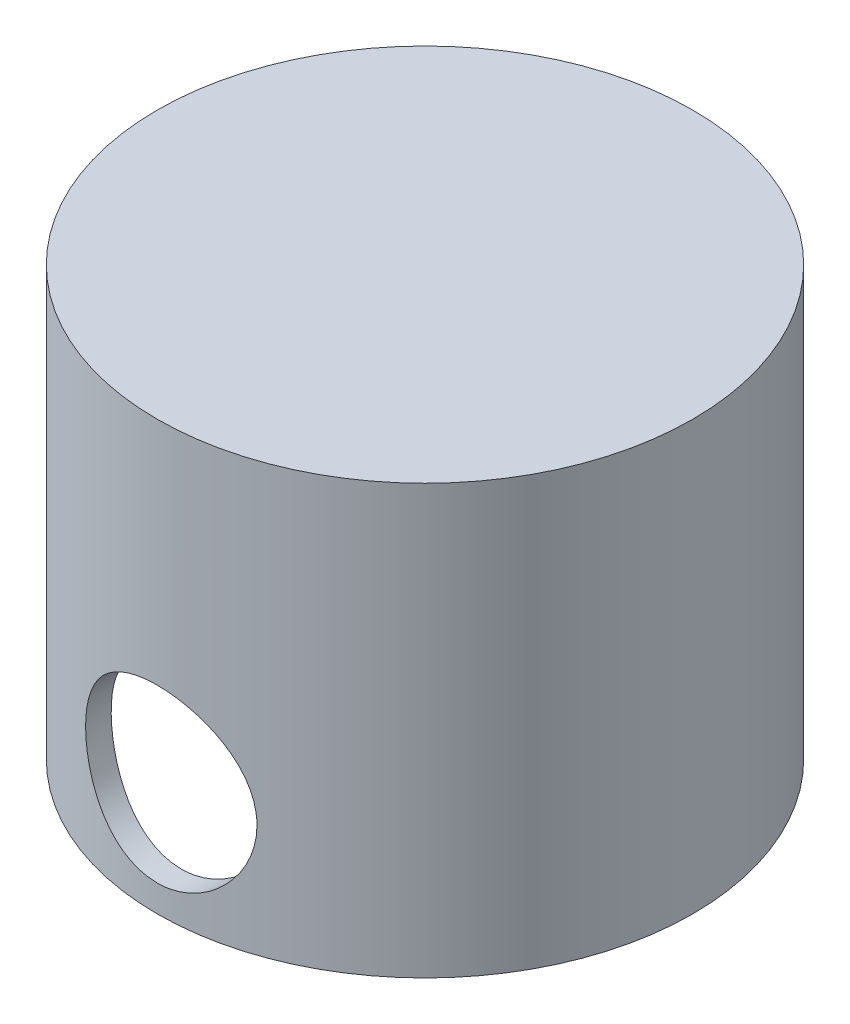
ISO-10303-21;
HEADER;
FILE_DESCRIPTION(('STEP AP214'),'2;1');
FILE_NAME('part.step','',(''),(''),'','','');
FILE_SCHEMA(('AUTOMOTIVE_DESIGN { 1 0 10303 214 1 1 1 1 }'));
ENDSEC;
DATA;
#1=APPLICATION_CONTEXT('core data for automotive mechanical design processes');
#2=APPLICATION_PROTOCOL_DEFINITION('international standard','automotive_design',2000,#1);
#3=PRODUCT_CONTEXT('',#1,'mechanical');
#4=PRODUCT('Part','Part','',(#3));
#5=PRODUCT_RELATED_PRODUCT_CATEGORY('part','',(#4));
#6=PRODUCT_DEFINITION_FORMATION('','',#4);
#7=PRODUCT_DEFINITION_CONTEXT('part definition',#1,'design');
#8=PRODUCT_DEFINITION('design','',#6,#7);
#9=PRODUCT_DEFINITION_SHAPE('','',#8);
#10=(LENGTH_UNIT() NAMED_UNIT(*) SI_UNIT(.MILLI.,.METRE.));
#11=(NAMED_UNIT(*) PLANE_ANGLE_UNIT() SI_UNIT($,.RADIAN.));
#12=(NAMED_UNIT(*) SI_UNIT($,.STERADIAN.) SOLID_ANGLE_UNIT());
#13=UNCERTAINTY_MEASURE_WITH_UNIT(LENGTH_MEASURE(1.E-05),#10,'distance_accuracy_value','');
#14=(GEOMETRIC_REPRESENTATION_CONTEXT(3) GLOBAL_UNCERTAINTY_ASSIGNED_CONTEXT((#13)) GLOBAL_UNIT_ASSIGNED_CONTEXT((#10,
#11,#12)) REPRESENTATION_CONTEXT('',''));
#15=CARTESIAN_POINT('',(0.,0.,0.));
#16=DIRECTION('',(0.,0.,1.));
#17=DIRECTION('',(1.,0.,0.));
#18=AXIS2_PLACEMENT_3D('',#15,#16,#17);
#19=CARTESIAN_POINT('',(0.,8.,0.));
#20=DIRECTION('',(0.,-1.,0.));
#21=DIRECTION('',(0.,0.,-1.));
#22=AXIS2_PLACEMENT_3D('',#19,#20,#21);
#23=CYLINDRICAL_SURFACE('',#22,5.);
#24=CARTESIAN_POINT('',(0.,3.7,-5.));
#25=CARTESIAN_POINT('',(-0.0874958063159798,3.69999975634942,-4.99999978543627));
#26=CARTESIAN_POINT('',(-0.174994637059061,3.69279940472074,-4.99768184156355));
#27=CARTESIAN_POINT('',(-0.347426901237483,3.66426818047074,-4.98866262172227));
#28=CARTESIAN_POINT('',(-0.432359863373708,3.64293472818209,-4.98196054553558));
#29=CARTESIAN_POINT('',(-0.597149225791565,3.58693507878823,-4.9649038363541));
#30=CARTESIAN_POINT('',(-0.677013473384596,3.55229010762939,-4.95455502045191));
#31=CARTESIAN_POINT('',(-0.829798762851158,3.47074316991274,-4.93126901642872));
#32=CARTESIAN_POINT('',(-0.902718607024946,3.42383909423439,-4.91833138300386));
#33=CARTESIAN_POINT('',(-1.04189475779498,3.31751588649597,-4.89077067933825));
#34=CARTESIAN_POINT('',(-1.1078960922464,3.25777290104658,-4.87610957732918));
#35=CARTESIAN_POINT('',(-1.22913423693228,3.12815693345259,-4.8469706570307));
#36=CARTESIAN_POINT('',(-1.28436891793797,3.05828195234513,-4.83249287552328));
#37=CARTESIAN_POINT('',(-1.38391395073831,2.90814714548961,-4.80494810799029));
#38=CARTESIAN_POINT('',(-1.42790123109944,2.82766371872945,-4.79192785635417));
#39=CARTESIAN_POINT('',(-1.5016091713459,2.65995765622989,-4.76934657798646));
#40=CARTESIAN_POINT('',(-1.53133379773326,2.57273690201169,-4.75978458968016));
#41=CARTESIAN_POINT('',(-1.57473134311321,2.39691739272712,-4.74560122760597));
#42=CARTESIAN_POINT('',(-1.58887896846385,2.30844789824797,-4.74083414932744));
#43=CARTESIAN_POINT('',(-1.60220433058851,2.13027240081554,-4.73634831045));
#44=CARTESIAN_POINT('',(-1.6013862709372,2.04056675214802,-4.73662813227306));
#45=CARTESIAN_POINT('',(-1.58517380736381,1.86643441511176,-4.74207619100075));
#46=CARTESIAN_POINT('',(-1.57038842132725,1.7819435465553,-4.7470401743042));
#47=CARTESIAN_POINT('',(-1.52765058974139,1.61671115557794,-4.76096457446162));
#48=CARTESIAN_POINT('',(-1.49969668269327,1.5359700504148,-4.76992543490025));
#49=CARTESIAN_POINT('',(-1.43099645158812,1.37910214117426,-4.7909865416364));
#50=CARTESIAN_POINT('',(-1.39006273103722,1.30306378004852,-4.80313229469362));
#51=CARTESIAN_POINT('',(-1.29669494334068,1.15873795697323,-4.82917444861168));
#52=CARTESIAN_POINT('',(-1.24425776827155,1.09045259725646,-4.8430713221454));
#53=CARTESIAN_POINT('',(-1.12640551540387,0.960135327133716,-4.87186372141871));
#54=CARTESIAN_POINT('',(-1.06048936249402,0.898559223061187,-4.8867752080818));
#55=CARTESIAN_POINT('',(-0.919081432217149,0.787221321766352,-4.91533168114877));
#56=CARTESIAN_POINT('',(-0.843588875652695,0.737460486857106,-4.92897656433707));
#57=CARTESIAN_POINT('',(-0.684261580712375,0.650836556719775,-4.95361789744584));
#58=CARTESIAN_POINT('',(-0.600361279440636,0.614086899163568,-4.96459080547942));
#59=CARTESIAN_POINT('',(-0.427135850361131,0.555360403337291,-4.98248161100196));
#60=CARTESIAN_POINT('',(-0.337812463131548,0.533378852183283,-4.98940080204637));
#61=CARTESIAN_POINT('',(-0.160141789589318,0.505599933334783,-4.99819424239135));
#62=CARTESIAN_POINT('',(-0.0719002860170735,0.499185926388898,-5.00026060178154));
#63=CARTESIAN_POINT('',(0.104410269588106,0.500979218221303,-4.99968655318444));
#64=CARTESIAN_POINT('',(0.19247934608744,0.50918426530988,-4.99704687004206));
#65=CARTESIAN_POINT('',(0.363535018203812,0.539490113081165,-4.98748380317497));
#66=CARTESIAN_POINT('',(0.446594362478023,0.561219910085902,-4.98067486649266));
#67=CARTESIAN_POINT('',(0.607861654600583,0.617501799396251,-4.96357585995349));
#68=CARTESIAN_POINT('',(0.686068993794125,0.652055496602176,-4.95328535439547));
#69=CARTESIAN_POINT('',(0.837596923870445,0.733971017178152,-4.92995531019905));
#70=CARTESIAN_POINT('',(0.910745620500967,0.781632511942304,-4.9168532627009));
#71=CARTESIAN_POINT('',(1.04821150300662,0.888053872985635,-4.8893940824048));
#72=CARTESIAN_POINT('',(1.11252617555398,0.946816886458304,-4.87503659432078));
#73=CARTESIAN_POINT('',(1.23328321488635,1.07667415961096,-4.84592967283237));
#74=CARTESIAN_POINT('',(1.2892857947562,1.14818026768848,-4.83118884166735));
#75=CARTESIAN_POINT('',(1.38854141992569,1.29989467445821,-4.80360443110145));
#76=CARTESIAN_POINT('',(1.43179457025642,1.38010290145405,-4.79076083607138));
#77=CARTESIAN_POINT('',(1.50407580301231,1.54684357865608,-4.76856262886575));
#78=CARTESIAN_POINT('',(1.53315066307446,1.63335413498969,-4.75919656820051));
#79=CARTESIAN_POINT('',(1.57620668246201,1.81040720981032,-4.74511281699328));
#80=CARTESIAN_POINT('',(1.59019395006567,1.90094808113598,-4.74039324536734));
#81=CARTESIAN_POINT('',(1.60222535311566,2.07887596916399,-4.73633927898768));
#82=CARTESIAN_POINT('',(1.60099388446006,2.16620901132899,-4.73676019091382));
#83=CARTESIAN_POINT('',(1.5843835514937,2.3393570054347,-4.74234159093745));
#84=CARTESIAN_POINT('',(1.56900540861121,2.42517203456103,-4.74750183734632));
#85=CARTESIAN_POINT('',(1.52503332416461,2.59148342537688,-4.76180543144416));
#86=CARTESIAN_POINT('',(1.49665627942706,2.67204319889287,-4.77088327236763));
#87=CARTESIAN_POINT('',(1.42766427484382,2.82732176040081,-4.79197975594362));
#88=CARTESIAN_POINT('',(1.38704674114626,2.9020393157627,-4.8039990169992));
#89=CARTESIAN_POINT('',(1.29279266707432,3.04680962981441,-4.83023494368376));
#90=CARTESIAN_POINT('',(1.23869308431579,3.11654826273404,-4.8445211905268));
#91=CARTESIAN_POINT('',(1.11981399792885,3.24619174582096,-4.87337180847353));
#92=CARTESIAN_POINT('',(1.05503158166823,3.30609390519864,-4.88793625446696));
#93=CARTESIAN_POINT('',(0.913912210298352,3.41645828592383,-4.91631108200117));
#94=CARTESIAN_POINT('',(0.83725135176078,3.4665189518843,-4.93007751880386));
#95=CARTESIAN_POINT('',(0.676163529926937,3.55298018809723,-4.9547378769786));
#96=CARTESIAN_POINT('',(0.591739263208157,3.58938547932079,-4.96563279071293));
#97=CARTESIAN_POINT('',(0.423663431644845,3.64524777983044,-4.98268341064065));
#98=CARTESIAN_POINT('',(0.34037676648733,3.66571845058311,-4.98911901301451));
#99=CARTESIAN_POINT('',(0.171394001076119,3.69309314290401,-4.99777693541394));
#100=CARTESIAN_POINT('',(0.0856984512613947,3.70000023864547,-5.00000021015613));
#101=CARTESIAN_POINT('',(0.,3.7,-5.));
#102=B_SPLINE_CURVE_WITH_KNOTS('',3,(#24,#25,#26,#27,#28,#29,#30,#31,#32,#33,#34,#35,#36,#37,
#38,#39,#40,#41,#42,#43,#44,#45,#46,#47,#48,#49,#50,#51,#52,#53,#54,#55,#56,#57,#58,#59,#60,#61,
#62,#63,#64,#65,#66,#67,#68,#69,#70,#71,#72,#73,#74,#75,#76,#77,#78,#79,#80,#81,#82,#83,#84,#85,
#86,#87,#88,#89,#90,#91,#92,#93,#94,#95,#96,#97,#98,#99,#100,#101),.UNSPECIFIED.,.T.,.F.,(4,2,2,
2,2,2,2,2,2,2,2,2,2,2,2,2,2,2,2,2,2,2,2,2,2,2,2,2,2,2,2,2,2,2,2,2,2,2,4),(0.,0.262172289866487,
0.524392446348364,0.786196202111712,1.04804502964703,1.31749718151567,1.58700256668426,
1.86354828826627,2.14001705671955,2.40780489999507,2.67551752794223,2.93207089351445,
3.18865273918778,3.44912195934763,3.70966163813009,3.98267284808623,4.25570628624555,
4.53106471334194,4.80633522466348,5.07051010591344,5.33464430132699,5.59183416387789,
5.84905622438333,6.11273355055081,6.37648573964818,6.6512299305306,6.92597185797942,
7.19980110675104,7.47351945288796,7.73426134972847,7.99498995042988,8.25151822881316,
8.50810048600705,8.77513756675922,9.04224757485583,9.3186628553126,9.5949824844973,
9.85182740305348,10.1086141011961),.UNSPECIFIED.);
#103=CARTESIAN_POINT('',(0.,3.7,-5.));
#104=VERTEX_POINT('',#103);
#105=EDGE_CURVE('E93',#104,#104,#102,.T.);
#106=ORIENTED_EDGE('',*,*,#105,.T.);
#107=EDGE_LOOP('',(#106));
#108=FACE_BOUND('',#107,.T.);
#109=CARTESIAN_POINT('',(1.6,2.1,4.7370877129308));
#110=CARTESIAN_POINT('',(1.59999974373874,2.01263376201709,4.73708798780949));
#111=CARTESIAN_POINT('',(1.59281993166463,1.9252644962471,4.73953109593308));
#112=CARTESIAN_POINT('',(1.56437769172507,1.75310041237817,4.7489937190314));
#113=CARTESIAN_POINT('',(1.54311199666736,1.66830619633013,4.75601429573487));
#114=CARTESIAN_POINT('',(1.48731021882536,1.50381189835967,4.77375701461625));
#115=CARTESIAN_POINT('',(1.45279850166911,1.42410277469806,4.78447235673699));
#116=CARTESIAN_POINT('',(1.37156634454408,1.27158235897785,4.80838765550231));
#117=CARTESIAN_POINT('',(1.32484355228541,1.19877239963129,4.82158809072754));
#118=CARTESIAN_POINT('',(1.21871241953147,1.0594936048683,4.84951968764674));
#119=CARTESIAN_POINT('',(1.15893934729319,0.993309834525259,4.86428678030524));
#120=CARTESIAN_POINT('',(1.02918412233017,0.871713574136107,4.89338280213669));
#121=CARTESIAN_POINT('',(0.959200473487308,0.81630266537781,4.90771166672489));
#122=CARTESIAN_POINT('',(0.808949422462771,0.716554614700008,4.93472953085556));
#123=CARTESIAN_POINT('',(0.728476687860992,0.672512850690743,4.94737131144711));
#124=CARTESIAN_POINT('',(0.560792193508548,0.598701436034369,4.96916970645467));
#125=CARTESIAN_POINT('',(0.473582105406685,0.56892825823732,4.97832718206453));
#126=CARTESIAN_POINT('',(0.297884710119076,0.525456220771644,4.99187078015161));
#127=CARTESIAN_POINT('',(0.209529388874192,0.511269742338392,4.99640130994181));
#128=CARTESIAN_POINT('',(0.0315841299204926,0.497826894498892,5.00069148119392));
#129=CARTESIAN_POINT('',(-0.0580055088308472,0.498566971198204,5.00045225829628));
#130=CARTESIAN_POINT('',(-0.232437491666958,0.514639501972373,4.9953294799159));
#131=CARTESIAN_POINT('',(-0.317334316303528,0.529442997840621,4.99061428137964));
#132=CARTESIAN_POINT('',(-0.48336829364963,0.572351823241146,4.97727793973528));
#133=CARTESIAN_POINT('',(-0.564505196993056,0.60045803365593,4.96865653796686));
#134=CARTESIAN_POINT('',(-0.721913949614886,0.66950323251782,4.94825462002066));
#135=CARTESIAN_POINT('',(-0.798111771873498,0.710599181593562,4.93643573330445));
#136=CARTESIAN_POINT('',(-0.942691437411139,0.804330206898552,4.9108788342044));
#137=CARTESIAN_POINT('',(-1.01107122500451,0.856968307470621,4.89714031917112));
#138=CARTESIAN_POINT('',(-1.14122552524351,0.974987641733184,4.86849469180912));
#139=CARTESIAN_POINT('',(-1.2025821378014,1.04082436305752,4.85356274482591));
#140=CARTESIAN_POINT('',(-1.31351207358059,1.1819882609796,4.8247258395209));
#141=CARTESIAN_POINT('',(-1.36308386476992,1.25731666955544,4.81082101488724));
#142=CARTESIAN_POINT('',(-1.44955524382539,1.41655674029327,4.78548357380621));
#143=CARTESIAN_POINT('',(-1.48629250439436,1.50056207537524,4.77408325840667));
#144=CARTESIAN_POINT('',(-1.54496461752815,1.67402080639224,4.75542251488665));
#145=CARTESIAN_POINT('',(-1.56690509705448,1.76347211719119,4.74816051319963));
#146=CARTESIAN_POINT('',(-1.59453893191269,1.94126391009052,4.73895031775712));
#147=CARTESIAN_POINT('',(-1.60087507754216,2.02949364832457,4.73679204354283));
#148=CARTESIAN_POINT('',(-1.59893067907134,2.20576427053874,4.73744898777772));
#149=CARTESIAN_POINT('',(-1.5906525297045,2.2938051830935,4.74026339139206));
#150=CARTESIAN_POINT('',(-1.56029013344713,2.46437702734367,4.7503404414304));
#151=CARTESIAN_POINT('',(-1.53863886571376,2.54699414669862,4.75746344492905));
#152=CARTESIAN_POINT('',(-1.48265712290061,2.70741115974012,4.77520515081817));
#153=CARTESIAN_POINT('',(-1.44832451458384,2.78521024037054,4.78582444131636));
#154=CARTESIAN_POINT('',(-1.3667895840503,2.93634784716175,4.80975442366493));
#155=CARTESIAN_POINT('',(-1.31923446955668,3.0094845588093,4.8231358439457));
#156=CARTESIAN_POINT('',(-1.2130119976528,3.1469734221838,4.85093919332853));
#157=CARTESIAN_POINT('',(-1.15434161483455,3.21132317400831,4.86536140505509));
#158=CARTESIAN_POINT('',(-1.02450097804918,3.3323191106342,4.89438512522789));
#159=CARTESIAN_POINT('',(-0.952895991490041,3.38850480158372,4.90896684906861));
#160=CARTESIAN_POINT('',(-0.800918884886269,3.48808507727672,4.93603865529218));
#161=CARTESIAN_POINT('',(-0.720547139344917,3.53148020812148,4.94852882696537));
#162=CARTESIAN_POINT('',(-0.553783760904261,3.60383599726771,4.96994289161967));
#163=CARTESIAN_POINT('',(-0.467439525556669,3.63289811841377,4.97889176140864));
#164=CARTESIAN_POINT('',(-0.290749982825202,3.67598410411073,4.9923242466308));
#165=CARTESIAN_POINT('',(-0.200406004983307,3.6900129273269,4.99680933438748));
#166=CARTESIAN_POINT('',(-0.0225106351625047,3.70221570789975,5.00070652519304));
#167=CARTESIAN_POINT('',(0.0649911044944392,3.70105331502989,5.00033097908979));
#168=CARTESIAN_POINT('',(0.238495437910279,3.68452291522176,4.99506275597099));
#169=CARTESIAN_POINT('',(0.324498137176767,3.66915591219964,4.99017039818283));
#170=CARTESIAN_POINT('',(0.491403041592258,3.62508172923404,4.97648934157747));
#171=CARTESIAN_POINT('',(0.572358868573165,3.59655962755433,4.96775477499445));
#172=CARTESIAN_POINT('',(0.728372537104162,3.52715339042773,4.9472892397229));
#173=CARTESIAN_POINT('',(0.803429341948619,3.48626708816543,4.93555774588147));
#174=CARTESIAN_POINT('',(0.94837785665468,3.39163889221453,4.90980554197593));
#175=CARTESIAN_POINT('',(1.01799645273276,3.33749676379537,4.89571902538267));
#176=CARTESIAN_POINT('',(1.14737920780259,3.21859072415985,4.86702383992102));
#177=CARTESIAN_POINT('',(1.20714033786284,3.15382356030674,4.85241501223218));
#178=CARTESIAN_POINT('',(1.31724196523931,3.01277335436299,4.82371532498013));
#179=CARTESIAN_POINT('',(1.36717640898326,2.93616499792532,4.80966084431258));
#180=CARTESIAN_POINT('',(1.45341388681981,2.77521529433033,4.78430967821654));
#181=CARTESIAN_POINT('',(1.48972176586894,2.69087670896938,4.77301201309667));
#182=CARTESIAN_POINT('',(1.5454160638658,2.52301715888516,4.75525868307298));
#183=CARTESIAN_POINT('',(1.56582251059464,2.43986484408344,4.74851573857385));
#184=CARTESIAN_POINT('',(1.59311272174624,2.27114220114767,4.73943073150288));
#185=CARTESIAN_POINT('',(1.60000025100005,2.18557255294307,4.73708744369556));
#186=CARTESIAN_POINT('',(1.6,2.1,4.7370877129308));
#187=B_SPLINE_CURVE_WITH_KNOTS('',3,(#109,#110,#111,#112,#113,#114,#115,#116,#117,#118,#119,
#120,#121,#122,#123,#124,#125,#126,#127,#128,#129,#130,#131,#132,#133,#134,#135,#136,#137,#138,
#139,#140,#141,#142,#143,#144,#145,#146,#147,#148,#149,#150,#151,#152,#153,#154,#155,#156,#157,
#158,#159,#160,#161,#162,#163,#164,#165,#166,#167,#168,#169,#170,#171,#172,#173,#174,#175,#176,
#177,#178,#179,#180,#181,#182,#183,#184,#185,#186),.UNSPECIFIED.,.T.,.F.,(4,2,2,2,2,2,2,2,2,2,2,
2,2,2,2,2,2,2,2,2,2,2,2,2,2,2,2,2,2,2,2,2,2,2,2,2,2,2,4),(0.,0.261782337086142,
0.523625415332401,0.784989132393395,1.04640323461352,1.31636217216967,1.58636070561341,
1.86279377491072,2.13915847552485,2.4066067441957,2.67399133630597,2.93170127402817,
3.18942827924008,3.45039690075846,3.71143398470616,3.98385068324257,4.25630277672778,
4.53208561817766,4.80776352492637,5.07187991332532,5.33595302699622,5.59189456344124,
5.84787917362796,6.1114865329221,6.37516574550518,6.65038672388641,6.92559594982594,
7.19882796886114,7.47196983578453,7.73322052820115,7.99445275803873,8.25211685877031,
8.50982614110575,8.77656491371796,9.04338549583878,9.3196060101,9.59572822026813,
9.85220743369916,10.1086152110862),.UNSPECIFIED.);
#188=CARTESIAN_POINT('',(1.6,2.1,4.7370877129308));
#189=VERTEX_POINT('',#188);
#190=EDGE_CURVE('E87',#189,#189,#187,.T.);
#191=ORIENTED_EDGE('',*,*,#190,.T.);
#192=EDGE_LOOP('',(#191));
#193=FACE_BOUND('',#192,.T.);
#194=CARTESIAN_POINT('',(0.,8.,0.));
#195=DIRECTION('',(0.,1.,0.));
#196=DIRECTION('',(0.,0.,1.));
#197=AXIS2_PLACEMENT_3D('',#194,#195,#196);
#198=CIRCLE('',#197,5.);
#199=CARTESIAN_POINT('',(0.,8.,5.));
#200=VERTEX_POINT('',#199);
#201=EDGE_CURVE('E10',#200,#200,#198,.T.);
#202=ORIENTED_EDGE('',*,*,#201,.F.);
#203=EDGE_LOOP('',(#202));
#204=FACE_BOUND('',#203,.T.);
#205=CARTESIAN_POINT('',(0.,0.,0.));
#206=DIRECTION('',(0.,1.,0.));
#207=DIRECTION('',(0.,0.,1.));
#208=AXIS2_PLACEMENT_3D('',#205,#206,#207);
#209=CIRCLE('',#208,5.);
#210=CARTESIAN_POINT('',(0.,0.,5.));
#211=VERTEX_POINT('',#210);
#212=EDGE_CURVE('E55',#211,#211,#209,.T.);
#213=ORIENTED_EDGE('',*,*,#212,.T.);
#214=EDGE_LOOP('',(#213));
#215=FACE_BOUND('',#214,.T.);
#216=ADVANCED_FACE('F41',(#108,#193,#204,#215),#23,.T.);
#217=CARTESIAN_POINT('',(0.,8.,0.));
#218=DIRECTION('',(0.,1.,0.));
#219=DIRECTION('',(0.,0.,1.));
#220=AXIS2_PLACEMENT_3D('',#217,#218,#219);
#221=PLANE('',#220);
#222=ORIENTED_EDGE('',*,*,#201,.T.);
#223=EDGE_LOOP('',(#222));
#224=FACE_BOUND('',#223,.T.);
#225=ADVANCED_FACE('F117',(#224),#221,.T.);
#226=CARTESIAN_POINT('',(0.,0.,0.));
#227=DIRECTION('',(0.,1.,0.));
#228=DIRECTION('',(0.,0.,1.));
#229=AXIS2_PLACEMENT_3D('',#226,#227,#228);
#230=PLANE('',#229);
#231=CARTESIAN_POINT('',(0.,0.,0.));
#232=DIRECTION('',(0.,1.,0.));
#233=DIRECTION('',(0.,0.,1.));
#234=AXIS2_PLACEMENT_3D('',#231,#232,#233);
#235=CIRCLE('',#234,4.55);
#236=CARTESIAN_POINT('',(0.,0.,4.55));
#237=VERTEX_POINT('',#236);
#238=EDGE_CURVE('E64',#237,#237,#235,.T.);
#239=ORIENTED_EDGE('',*,*,#238,.T.);
#240=EDGE_LOOP('',(#239));
#241=FACE_BOUND('',#240,.T.);
#242=ORIENTED_EDGE('',*,*,#212,.F.);
#243=EDGE_LOOP('',(#242));
#244=FACE_BOUND('',#243,.T.);
#245=ADVANCED_FACE('F107',(#241,#244),#230,.F.);
#246=CARTESIAN_POINT('',(0.,7.1,0.));
#247=DIRECTION('',(0.,-1.,0.));
#248=DIRECTION('',(0.,0.,-1.));
#249=AXIS2_PLACEMENT_3D('',#246,#247,#248);
#250=CYLINDRICAL_SURFACE('',#249,4.55);
#251=CARTESIAN_POINT('',(0.,3.7,-4.55));
#252=CARTESIAN_POINT('',(-0.0870233118100431,3.70000145396041,-4.55000102655444));
#253=CARTESIAN_POINT('',(-0.174036239651451,3.69287750862151,-4.54748090367057));
#254=CARTESIAN_POINT('',(-0.345482749233556,3.66466901047303,-4.53767732394049));
#255=CARTESIAN_POINT('',(-0.42991634484883,3.64358453277289,-4.53039389272149));
#256=CARTESIAN_POINT('',(-0.593707758451639,3.5882785422879,-4.51185105463228));
#257=CARTESIAN_POINT('',(-0.673074334900378,3.55408045559588,-4.50059874061409));
#258=CARTESIAN_POINT('',(-0.824943016891266,3.47362957475682,-4.47525464601204));
#259=CARTESIAN_POINT('',(-0.897443537116019,3.42737400584015,-4.46116221200536));
#260=CARTESIAN_POINT('',(-1.03627915462031,3.32227796494438,-4.43100977117256));
#261=CARTESIAN_POINT('',(-1.1023176755186,3.26306041375534,-4.41489887362218));
#262=CARTESIAN_POINT('',(-1.22375839539245,3.13452237506787,-4.38279230738867));
#263=CARTESIAN_POINT('',(-1.27915788350704,3.06519932054779,-4.36679666907061));
#264=CARTESIAN_POINT('',(-1.37952186378372,2.91565163616644,-4.33615830660939));
#265=CARTESIAN_POINT('',(-1.4240866813026,2.83514500840305,-4.3215767923104));
#266=CARTESIAN_POINT('',(-1.49891483189955,2.66718450399273,-4.29619914797862));
#267=CARTESIAN_POINT('',(-1.5291830971174,2.57973303541307,-4.2854017128159));
#268=CARTESIAN_POINT('',(-1.57342126476191,2.40375780901836,-4.26935407116003));
#269=CARTESIAN_POINT('',(-1.5879515782005,2.3153928085436,-4.26391380120829));
#270=CARTESIAN_POINT('',(-1.60205375853197,2.13732433745344,-4.25863663558588));
#271=CARTESIAN_POINT('',(-1.60163088352811,2.04762134841581,-4.25879777025041));
#272=CARTESIAN_POINT('',(-1.58627094768672,1.8743453680991,-4.26453978276728));
#273=CARTESIAN_POINT('',(-1.57208407528578,1.79069493657149,-4.26984052410087));
#274=CARTESIAN_POINT('',(-1.53082964100558,1.62704777204241,-4.28480303868931));
#275=CARTESIAN_POINT('',(-1.50376037184343,1.54705152486454,-4.29446538997241));
#276=CARTESIAN_POINT('',(-1.43705299962926,1.39135466921991,-4.3172485409837));
#277=CARTESIAN_POINT('',(-1.39720462727462,1.3157528827485,-4.33042652979475));
#278=CARTESIAN_POINT('',(-1.30621631347688,1.17208029708319,-4.35873425905318));
#279=CARTESIAN_POINT('',(-1.25507282527421,1.10401187352793,-4.37386461193719));
#280=CARTESIAN_POINT('',(-1.13941596184281,0.973148553618252,-4.4054539388294));
#281=CARTESIAN_POINT('',(-1.07429527031387,0.910895470985802,-4.42193884512901));
#282=CARTESIAN_POINT('',(-0.934340027252315,0.798043662338905,-4.45361095417607));
#283=CARTESIAN_POINT('',(-0.859504323213281,0.747446321041469,-4.46879800260165));
#284=CARTESIAN_POINT('',(-0.700995597628487,0.658839109732616,-4.4964036522658));
#285=CARTESIAN_POINT('',(-0.617226396213963,0.620989359271367,-4.50878644021072));
#286=CARTESIAN_POINT('',(-0.443968054673707,0.560092565734844,-4.52912628071984));
#287=CARTESIAN_POINT('',(-0.354481151050624,0.537039773273728,-4.53708505208274));
#288=CARTESIAN_POINT('',(-0.176903099955932,0.507385812919795,-4.54738792771796));
#289=CARTESIAN_POINT('',(-0.0889483418489477,0.500053636689132,-4.54998130622963));
#290=CARTESIAN_POINT('',(0.0869616847487501,0.49994697979987,-4.55001847701499));
#291=CARTESIAN_POINT('',(0.174916949941998,0.507169722601389,-4.5474632514518));
#292=CARTESIAN_POINT('',(0.345306480528808,0.53539846985975,-4.53765507916131));
#293=CARTESIAN_POINT('',(0.427827179112765,0.555942971687887,-4.53055952675269));
#294=CARTESIAN_POINT('',(0.588207147445315,0.609642052071436,-4.51254139325854));
#295=CARTESIAN_POINT('',(0.666065811956526,0.64279826382143,-4.50161831652968));
#296=CARTESIAN_POINT('',(0.817329629907525,0.721792856556722,-4.47666340347118));
#297=CARTESIAN_POINT('',(0.890550794797324,0.767958188077538,-4.46255358295105));
#298=CARTESIAN_POINT('',(1.02843722143466,0.871283135897911,-4.43280953495104));
#299=CARTESIAN_POINT('',(1.09309960808781,0.928446430929595,-4.41717479826395));
#300=CARTESIAN_POINT('',(1.21546096283665,1.05557365110872,-4.38512935060044));
#301=CARTESIAN_POINT('',(1.27263896963841,1.1260405108052,-4.36871958873586));
#302=CARTESIAN_POINT('',(1.37443928750152,1.27591146411311,-4.33777090406916));
#303=CARTESIAN_POINT('',(1.41906111981852,1.35531589833663,-4.32323205261295));
#304=CARTESIAN_POINT('',(1.49436667897294,1.52107598002373,-4.29778519978047));
#305=CARTESIAN_POINT('',(1.5250468833107,1.60743337774629,-4.28687811619456));
#306=CARTESIAN_POINT('',(1.57126394604957,1.78456955682069,-4.27015754082023));
#307=CARTESIAN_POINT('',(1.58680867345922,1.8753460148767,-4.26434140238359));
#308=CARTESIAN_POINT('',(1.60165916854778,2.05317693984812,-4.25878439464498));
#309=CARTESIAN_POINT('',(1.6018395160162,2.1401488729698,-4.2587163321961));
#310=CARTESIAN_POINT('',(1.58814641473799,2.31281310400062,-4.26384136850411));
#311=CARTESIAN_POINT('',(1.57427399449375,2.39850549509188,-4.26903408223215));
#312=CARTESIAN_POINT('',(1.53351631744419,2.564149911636,-4.28383912385897));
#313=CARTESIAN_POINT('',(1.50694536807459,2.64418961760752,-4.2933444348482));
#314=CARTESIAN_POINT('',(1.44180817625562,2.79873135201944,-4.31565391199357));
#315=CARTESIAN_POINT('',(1.4032390960564,2.87323206522921,-4.32845885844317));
#316=CARTESIAN_POINT('',(1.31306453310299,3.01842699260544,-4.35668355785987));
#317=CARTESIAN_POINT('',(1.26092621368523,3.0887715748058,-4.37219871679444));
#318=CARTESIAN_POINT('',(1.1459609274794,3.21999448428808,-4.40372825915337));
#319=CARTESIAN_POINT('',(1.08313077859081,3.28086998302871,-4.4197427900384));
#320=CARTESIAN_POINT('',(0.945161261561154,3.39421519052148,-4.45133608239596));
#321=CARTESIAN_POINT('',(0.869593842363002,3.44618050496137,-4.46686241772374));
#322=CARTESIAN_POINT('',(0.710268205527746,3.53663028820553,-4.49494743925532));
#323=CARTESIAN_POINT('',(0.626510968700618,3.57511636875537,-4.50750648020743));
#324=CARTESIAN_POINT('',(0.453768246041749,3.63702528360714,-4.52814498230708));
#325=CARTESIAN_POINT('',(0.364826076149036,3.66055756884424,-4.53625693139598));
#326=CARTESIAN_POINT('',(0.183918004467553,3.69204134934906,-4.54718294258022));
#327=CARTESIAN_POINT('',(0.0919532053325146,3.69999846367235,-4.54999891529098));
#328=CARTESIAN_POINT('',(0.,3.7,-4.55));
#329=B_SPLINE_CURVE_WITH_KNOTS('',3,(#251,#252,#253,#254,#255,#256,#257,#258,#259,#260,#261,
#262,#263,#264,#265,#266,#267,#268,#269,#270,#271,#272,#273,#274,#275,#276,#277,#278,#279,#280,
#281,#282,#283,#284,#285,#286,#287,#288,#289,#290,#291,#292,#293,#294,#295,#296,#297,#298,#299,
#300,#301,#302,#303,#304,#305,#306,#307,#308,#309,#310,#311,#312,#313,#314,#315,#316,#317,#318,
#319,#320,#321,#322,#323,#324,#325,#326,#327,#328),.UNSPECIFIED.,.T.,.F.,(4,2,2,2,2,2,2,2,2,2,2,
2,2,2,2,2,2,2,2,2,2,2,2,2,2,2,2,2,2,2,2,2,2,2,2,2,2,2,4),(0.,0.260731203776251,0.52146100479702,
0.78172719289868,1.04205332861168,1.31130412187907,1.58062343038188,1.85873438378786,
2.13674932203193,2.40450125904802,2.67215904535261,2.92600329021101,3.17988118600284,
3.43817147159274,3.69654297807227,3.97003634503581,4.24356218662491,4.52040567467323,
4.79714152944422,5.06070197976987,5.32421215727533,5.57904887008821,5.83391859505525,
6.09587394945584,6.35791707867531,6.63327876135801,6.90865094166411,7.18409265903005,
7.45939109631201,7.71900772394617,7.97860535197542,8.23208638895912,8.48562742390341,
8.75122867924675,9.0169091214873,9.29459987693639,9.5722574168651,9.84785855895515,
10.1233602540615),.UNSPECIFIED.);
#330=CARTESIAN_POINT('',(0.,3.7,-4.55));
#331=VERTEX_POINT('',#330);
#332=EDGE_CURVE('E45',#331,#331,#329,.T.);
#333=ORIENTED_EDGE('',*,*,#332,.F.);
#334=EDGE_LOOP('',(#333));
#335=FACE_BOUND('',#334,.T.);
#336=CARTESIAN_POINT('',(1.6,2.1,4.25940136638941));
#337=CARTESIAN_POINT('',(1.60000150456417,2.01316490436857,4.25940008156464));
#338=CARTESIAN_POINT('',(1.59290718044903,1.92634028126036,4.26208574406815));
#339=CARTESIAN_POINT('',(1.56482705730784,1.75528294085497,4.2724742611743));
#340=CARTESIAN_POINT('',(1.54384021322437,1.6710504190461,4.28017749322025));
#341=CARTESIAN_POINT('',(1.48881925063878,1.50768732664617,4.29962300665676));
#342=CARTESIAN_POINT('',(1.45481307685405,1.42854624982233,4.31135663169531));
#343=CARTESIAN_POINT('',(1.37481586860051,1.27706423156257,4.33752769113518));
#344=CARTESIAN_POINT('',(1.32882174841323,1.20472504747898,4.35196582141133));
#345=CARTESIAN_POINT('',(1.2240059130766,1.06574591101064,4.3826248894454));
#346=CARTESIAN_POINT('',(1.1647481964248,0.999445280368102,4.39889379585848));
#347=CARTESIAN_POINT('',(1.03601545914527,0.877487924868258,4.43097819248418));
#348=CARTESIAN_POINT('',(0.966538584606286,0.821833135552508,4.44679359980173));
#349=CARTESIAN_POINT('',(0.816818273816501,0.721167633892623,4.47675068793796));
#350=CARTESIAN_POINT('',(0.736318278831367,0.676518119118642,4.49082946181761));
#351=CARTESIAN_POINT('',(0.568368701752937,0.601531866449613,4.51515698570417));
#352=CARTESIAN_POINT('',(0.480921228400218,0.571190804813011,4.52540689252677));
#353=CARTESIAN_POINT('',(0.305120938540032,0.526850087929075,4.54058173102342));
#354=CARTESIAN_POINT('',(0.21693169406433,0.512267919269297,4.54569594444619));
#355=CARTESIAN_POINT('',(0.0392195767410033,0.498000661095189,4.55069820551501));
#356=CARTESIAN_POINT('',(-0.0503029070048989,0.498311307148053,4.55058774920162));
#357=CARTESIAN_POINT('',(-0.223995116139908,0.513464226544649,4.54527805322848));
#358=CARTESIAN_POINT('',(-0.308228075762741,0.527672524120837,4.54030082665972));
#359=CARTESIAN_POINT('',(-0.47302737493516,0.569161363495028,4.52610088085596));
#360=CARTESIAN_POINT('',(-0.553593459485247,0.596442812901596,4.51687786685729));
#361=CARTESIAN_POINT('',(-0.710088396293965,0.663640589523208,4.49495377333163));
#362=CARTESIAN_POINT('',(-0.78593765984091,0.703726518600373,4.4822063346412));
#363=CARTESIAN_POINT('',(-0.930011186036497,0.795251533832339,4.45454472845031));
#364=CARTESIAN_POINT('',(-0.998233160913217,0.84669401264521,4.43962991392351));
#365=CARTESIAN_POINT('',(-1.12887355469305,0.962608079848221,4.40827542993441));
#366=CARTESIAN_POINT('',(-1.19080551110342,1.02761820371081,4.39179679809617));
#367=CARTESIAN_POINT('',(-1.30305689270068,1.16722586433379,4.3598116434591));
#368=CARTESIAN_POINT('',(-1.35337408249155,1.24182524236284,4.34430530820755));
#369=CARTESIAN_POINT('',(-1.441746571776,1.40019438619846,4.31579292854048));
#370=CARTESIAN_POINT('',(-1.47957278237192,1.48410136455104,4.30283519191797));
#371=CARTESIAN_POINT('',(-1.54038520011113,1.65766718966567,4.28144426558617));
#372=CARTESIAN_POINT('',(-1.56337847999429,1.74732327264544,4.27300891980406));
#373=CARTESIAN_POINT('',(-1.59283278497101,1.92508666720314,4.26211444862422));
#374=CARTESIAN_POINT('',(-1.60005627508115,2.01305072780326,4.25938000396713));
#375=CARTESIAN_POINT('',(-1.59994309489346,2.1889576748782,4.25942296542751));
#376=CARTESIAN_POINT('',(-1.59260946765948,2.27690056193573,4.26219921957183));
#377=CARTESIAN_POINT('',(-1.56427825101761,2.44661793468084,4.27267401175021));
#378=CARTESIAN_POINT('',(-1.54383507258378,2.5284986774563,4.28017261754014));
#379=CARTESIAN_POINT('',(-1.4905439582047,2.68764299514934,4.29901987966826));
#380=CARTESIAN_POINT('',(-1.45769367189052,2.76490569202272,4.31036926544635));
#381=CARTESIAN_POINT('',(-1.3792444788609,2.91556390571302,4.33612039267337));
#382=CARTESIAN_POINT('',(-1.33324669105001,2.98873565976365,4.35061353195759));
#383=CARTESIAN_POINT('',(-1.2302481412082,3.12659570789256,4.38085222369459));
#384=CARTESIAN_POINT('',(-1.17324379072977,3.19128122363678,4.39659818361495));
#385=CARTESIAN_POINT('',(-1.04616641417335,3.31398231213964,4.42860603781013));
#386=CARTESIAN_POINT('',(-0.975550450669097,3.37144221727806,4.44484927900735));
#387=CARTESIAN_POINT('',(-0.825277505049462,3.47374561613709,4.47518539999211));
#388=CARTESIAN_POINT('',(-0.745620720068718,3.51858938487774,4.48927832665144));
#389=CARTESIAN_POINT('',(-0.579799482743422,3.59401453280004,4.51368016442299));
#390=CARTESIAN_POINT('',(-0.493673572562769,3.62467363290503,4.52400962848257));
#391=CARTESIAN_POINT('',(-0.317047715369151,3.67092501674467,4.53980474554203));
#392=CARTESIAN_POINT('',(-0.226549563148541,3.68652342858561,4.54527237672172));
#393=CARTESIAN_POINT('',(-0.0488035961967334,3.70161126973626,4.55056196662549));
#394=CARTESIAN_POINT('',(0.0383692290244436,3.70189453937777,4.55066213805368));
#395=CARTESIAN_POINT('',(0.211463204161497,3.68833801572874,4.54590775151684));
#396=CARTESIAN_POINT('',(0.297384474816301,3.67449959404981,4.54105367474801));
#397=CARTESIAN_POINT('',(0.463867433239907,3.63363459995142,4.52704964632602));
#398=CARTESIAN_POINT('',(0.544500607280042,3.60686805734807,4.51798452548774));
#399=CARTESIAN_POINT('',(0.700153282669545,3.54115444861315,4.49649475495527));
#400=CARTESIAN_POINT('',(0.775171735034181,3.50220511340504,4.48406947948204));
#401=CARTESIAN_POINT('',(0.920692117203358,3.41147445443021,4.45651519227966));
#402=CARTESIAN_POINT('',(0.990899905855047,3.35924826232092,4.44129898576513));
#403=CARTESIAN_POINT('',(1.12180900312569,3.24417868039137,4.41005464356969));
#404=CARTESIAN_POINT('',(1.18250709792163,3.18133171610785,4.394026235815));
#405=CARTESIAN_POINT('',(1.29545951425216,3.04343901282885,4.36209668370963));
#406=CARTESIAN_POINT('',(1.34721244430138,2.96797229703655,4.34623355542726));
#407=CARTESIAN_POINT('',(1.43728715289241,2.80891133659257,4.31728547506454));
#408=CARTESIAN_POINT('',(1.47561048178106,2.72531803151895,4.30420020237037));
#409=CARTESIAN_POINT('',(1.53726297919672,2.55291851956502,4.28256830635149));
#410=CARTESIAN_POINT('',(1.5607039426366,2.46415678286511,4.27398792918243));
#411=CARTESIAN_POINT('',(1.59206808265866,2.28359184931167,4.26240642366803));
#412=CARTESIAN_POINT('',(1.59999840958249,2.19179007376224,4.25940272452876));
#413=CARTESIAN_POINT('',(1.6,2.1,4.25940136638941));
#414=B_SPLINE_CURVE_WITH_KNOTS('',3,(#336,#337,#338,#339,#340,#341,#342,#343,#344,#345,#346,
#347,#348,#349,#350,#351,#352,#353,#354,#355,#356,#357,#358,#359,#360,#361,#362,#363,#364,#365,
#366,#367,#368,#369,#370,#371,#372,#373,#374,#375,#376,#377,#378,#379,#380,#381,#382,#383,#384,
#385,#386,#387,#388,#389,#390,#391,#392,#393,#394,#395,#396,#397,#398,#399,#400,#401,#402,#403,
#404,#405,#406,#407,#408,#409,#410,#411,#412,#413),.UNSPECIFIED.,.T.,.F.,(4,2,2,2,2,2,2,2,2,2,2,
2,2,2,2,2,2,2,2,2,2,2,2,2,2,2,2,2,2,2,2,2,2,2,2,2,2,2,4),(0.,0.260164562231,0.520348697427338,
0.779977475683962,1.03967314895663,1.30965715042858,1.5796901916692,1.85766522987266,
2.13555621541327,2.40278128167055,2.66992983072454,2.92543425753204,3.18095642540257,
3.44001417681551,3.69914942417599,3.97176382979994,4.24443065955042,4.52185158059863,
4.79914012193051,5.06269397761413,5.32619274500473,5.57922333844843,5.83230188938434,
6.0940670985124,6.35591779497191,6.63203980428751,6.90815579393349,7.18274042382661,
7.45721327969101,7.71744477941548,7.9776510057808,8.23282873228509,8.48805401462813,
8.75332867425006,9.01869279156934,9.29596981154858,9.57321481142017,9.84835173258508,
10.1233617868017),.UNSPECIFIED.);
#415=CARTESIAN_POINT('',(1.6,2.1,4.25940136638941));
#416=VERTEX_POINT('',#415);
#417=EDGE_CURVE('E66',#416,#416,#414,.T.);
#418=ORIENTED_EDGE('',*,*,#417,.F.);
#419=EDGE_LOOP('',(#418));
#420=FACE_BOUND('',#419,.T.);
#421=CARTESIAN_POINT('',(0.,7.1,0.));
#422=DIRECTION('',(0.,1.,0.));
#423=DIRECTION('',(0.,0.,1.));
#424=AXIS2_PLACEMENT_3D('',#421,#422,#423);
#425=CIRCLE('',#424,4.55);
#426=CARTESIAN_POINT('',(0.,7.1,4.55));
#427=VERTEX_POINT('',#426);
#428=EDGE_CURVE('E61',#427,#427,#425,.T.);
#429=ORIENTED_EDGE('',*,*,#428,.T.);
#430=EDGE_LOOP('',(#429));
#431=FACE_BOUND('',#430,.T.);
#432=ORIENTED_EDGE('',*,*,#238,.F.);
#433=EDGE_LOOP('',(#432));
#434=FACE_BOUND('',#433,.T.);
#435=ADVANCED_FACE('F72',(#335,#420,#431,#434),#250,.F.);
#436=CARTESIAN_POINT('',(0.,7.1,0.));
#437=DIRECTION('',(0.,1.,0.));
#438=DIRECTION('',(0.,0.,1.));
#439=AXIS2_PLACEMENT_3D('',#436,#437,#438);
#440=PLANE('',#439);
#441=ORIENTED_EDGE('',*,*,#428,.F.);
#442=EDGE_LOOP('',(#441));
#443=FACE_BOUND('',#442,.T.);
#444=ADVANCED_FACE('F81',(#443),#440,.F.);
#445=CARTESIAN_POINT('',(0.,2.1,-5.));
#446=DIRECTION('',(0.,0.,1.));
#447=DIRECTION('',(1.,0.,0.));
#448=AXIS2_PLACEMENT_3D('',#445,#446,#447);
#449=CYLINDRICAL_SURFACE('',#448,1.6);
#450=ORIENTED_EDGE('',*,*,#417,.T.);
#451=EDGE_LOOP('',(#450));
#452=FACE_BOUND('',#451,.T.);
#453=ORIENTED_EDGE('',*,*,#190,.F.);
#454=EDGE_LOOP('',(#453));
#455=FACE_BOUND('',#454,.T.);
#456=ADVANCED_FACE('F79',(#452,#455),#449,.F.);
#457=ORIENTED_EDGE('',*,*,#332,.T.);
#458=EDGE_LOOP('',(#457));
#459=FACE_BOUND('',#458,.T.);
#460=ORIENTED_EDGE('',*,*,#105,.F.);
#461=EDGE_LOOP('',(#460));
#462=FACE_BOUND('',#461,.T.);
#463=ADVANCED_FACE('F76',(#459,#462),#449,.F.);
#464=CLOSED_SHELL('',(#216,#225,#245,#435,#444,#456,#463));
#465=MANIFOLD_SOLID_BREP('B2',#464);
#466=ADVANCED_BREP_SHAPE_REPRESENTATION('',(#18,#465),#14);
#467=SHAPE_DEFINITION_REPRESENTATION(#9,#466);
ENDSEC;
END-ISO-10303-21;
